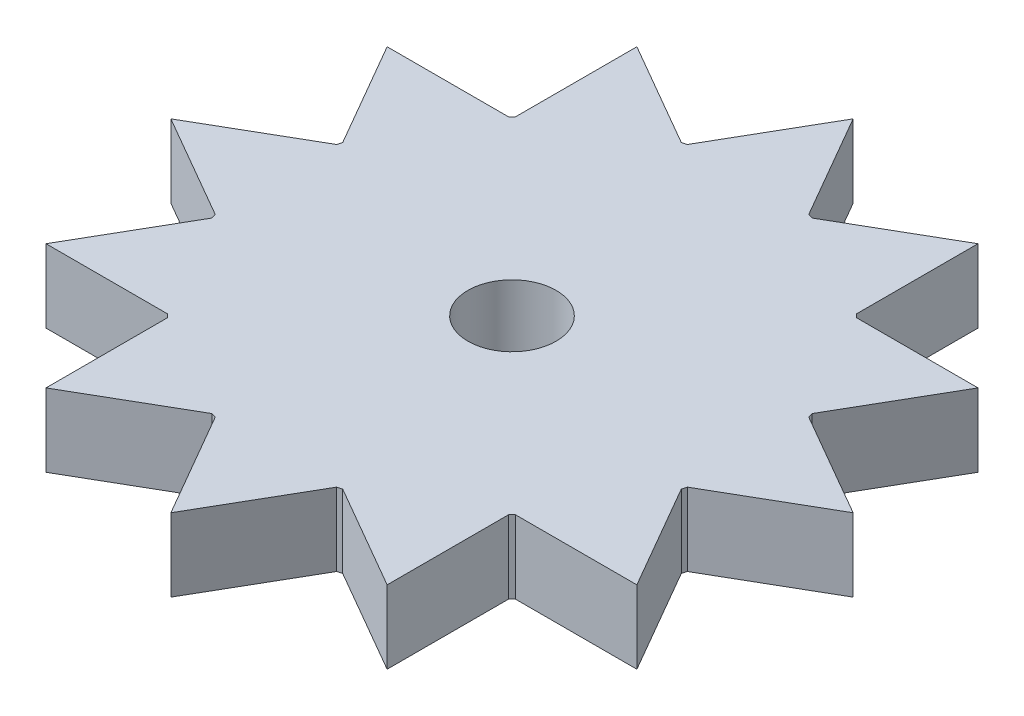
ISO-10303-21;
HEADER;
FILE_DESCRIPTION(('STEP AP214'),'2;1');
FILE_NAME('part.step','',(''),(''),'','','');
FILE_SCHEMA(('AUTOMOTIVE_DESIGN { 1 0 10303 214 1 1 1 1 }'));
ENDSEC;
DATA;
#1=APPLICATION_CONTEXT('core data for automotive mechanical design processes');
#2=APPLICATION_PROTOCOL_DEFINITION('international standard','automotive_design',2000,#1);
#3=PRODUCT_CONTEXT('',#1,'mechanical');
#4=PRODUCT('Part','Part','',(#3));
#5=PRODUCT_RELATED_PRODUCT_CATEGORY('part','',(#4));
#6=PRODUCT_DEFINITION_FORMATION('','',#4);
#7=PRODUCT_DEFINITION_CONTEXT('part definition',#1,'design');
#8=PRODUCT_DEFINITION('design','',#6,#7);
#9=PRODUCT_DEFINITION_SHAPE('','',#8);
#10=(LENGTH_UNIT() NAMED_UNIT(*) SI_UNIT(.MILLI.,.METRE.));
#11=(NAMED_UNIT(*) PLANE_ANGLE_UNIT() SI_UNIT($,.RADIAN.));
#12=(NAMED_UNIT(*) SI_UNIT($,.STERADIAN.) SOLID_ANGLE_UNIT());
#13=UNCERTAINTY_MEASURE_WITH_UNIT(LENGTH_MEASURE(1.E-05),#10,'distance_accuracy_value','');
#14=(GEOMETRIC_REPRESENTATION_CONTEXT(3) GLOBAL_UNCERTAINTY_ASSIGNED_CONTEXT((#13)) GLOBAL_UNIT_ASSIGNED_CONTEXT((#10,
#11,#12)) REPRESENTATION_CONTEXT('',''));
#15=CARTESIAN_POINT('',(0.,0.,0.));
#16=DIRECTION('',(0.,0.,1.));
#17=DIRECTION('',(1.,0.,0.));
#18=AXIS2_PLACEMENT_3D('',#15,#16,#17);
#19=CARTESIAN_POINT('',(0.,3.,0.));
#20=DIRECTION('',(0.,-1.,0.));
#21=DIRECTION('',(0.,0.,-1.));
#22=AXIS2_PLACEMENT_3D('',#19,#20,#21);
#23=CYLINDRICAL_SURFACE('',#22,10.);
#24=CARTESIAN_POINT('',(0.,0.,0.));
#25=DIRECTION('',(0.,1.,0.));
#26=DIRECTION('',(0.,0.,1.));
#27=AXIS2_PLACEMENT_3D('',#24,#25,#26);
#28=CIRCLE('',#27,10.);
#29=CARTESIAN_POINT('',(7.14142842854277,0.,-7.00000000000008));
#30=VERTEX_POINT('',#29);
#31=CARTESIAN_POINT('',(6.99999999999991,0.,-7.14142842854294));
#32=VERTEX_POINT('',#31);
#33=EDGE_CURVE('E516',#30,#32,#28,.T.);
#34=ORIENTED_EDGE('',*,*,#33,.T.);
#35=DIRECTION('',(0.,1.,0.));
#36=VECTOR('',#35,1.);
#37=CARTESIAN_POINT('',(6.99999999999991,0.,-7.14142842854294));
#38=LINE('',#37,#36);
#39=CARTESIAN_POINT('',(6.99999999999991,3.,-7.14142842854294));
#40=VERTEX_POINT('',#39);
#41=EDGE_CURVE('E289',#32,#40,#38,.T.);
#42=ORIENTED_EDGE('',*,*,#41,.T.);
#43=CARTESIAN_POINT('',(0.,3.,0.));
#44=DIRECTION('',(0.,1.,0.));
#45=DIRECTION('',(0.,0.,1.));
#46=AXIS2_PLACEMENT_3D('',#43,#44,#45);
#47=CIRCLE('',#46,10.);
#48=CARTESIAN_POINT('',(7.14142842854277,3.,-7.00000000000008));
#49=VERTEX_POINT('',#48);
#50=EDGE_CURVE('E508',#49,#40,#47,.T.);
#51=ORIENTED_EDGE('',*,*,#50,.F.);
#52=DIRECTION('',(0.,1.,0.));
#53=VECTOR('',#52,1.);
#54=CARTESIAN_POINT('',(7.14142842854277,0.,-7.00000000000008));
#55=LINE('',#54,#53);
#56=EDGE_CURVE('E314',#30,#49,#55,.T.);
#57=ORIENTED_EDGE('',*,*,#56,.F.);
#58=EDGE_LOOP('',(#34,#42,#51,#57));
#59=FACE_BOUND('',#58,.T.);
#60=ADVANCED_FACE('F33',(#59),#23,.T.);
#61=CARTESIAN_POINT('',(9.68465843842647,0.,-2.49146361221975));
#62=VERTEX_POINT('',#61);
#63=CARTESIAN_POINT('',(9.63289204076247,0.,-2.6846584384266));
#64=VERTEX_POINT('',#63);
#65=EDGE_CURVE('E517',#62,#64,#28,.T.);
#66=ORIENTED_EDGE('',*,*,#65,.T.);
#67=DIRECTION('',(0.,1.,0.));
#68=VECTOR('',#67,1.);
#69=CARTESIAN_POINT('',(9.63289204076247,0.,-2.6846584384266));
#70=LINE('',#69,#68);
#71=CARTESIAN_POINT('',(9.63289204076247,3.,-2.6846584384266));
#72=VERTEX_POINT('',#71);
#73=EDGE_CURVE('E310',#64,#72,#70,.T.);
#74=ORIENTED_EDGE('',*,*,#73,.T.);
#75=CARTESIAN_POINT('',(9.68465843842647,3.,-2.49146361221975));
#76=VERTEX_POINT('',#75);
#77=EDGE_CURVE('E509',#76,#72,#47,.T.);
#78=ORIENTED_EDGE('',*,*,#77,.F.);
#79=DIRECTION('',(0.,1.,0.));
#80=VECTOR('',#79,1.);
#81=CARTESIAN_POINT('',(9.68465843842647,0.,-2.49146361221975));
#82=LINE('',#81,#80);
#83=EDGE_CURVE('E331',#62,#76,#82,.T.);
#84=ORIENTED_EDGE('',*,*,#83,.F.);
#85=EDGE_LOOP('',(#66,#74,#78,#84));
#86=FACE_BOUND('',#85,.T.);
#87=ADVANCED_FACE('F592',(#86),#23,.T.);
#88=CARTESIAN_POINT('',(9.63289204076252,0.,2.6846584384264));
#89=VERTEX_POINT('',#88);
#90=CARTESIAN_POINT('',(9.68465843842652,0.,2.49146361221954));
#91=VERTEX_POINT('',#90);
#92=EDGE_CURVE('E521',#89,#91,#28,.T.);
#93=ORIENTED_EDGE('',*,*,#92,.T.);
#94=DIRECTION('',(0.,1.,0.));
#95=VECTOR('',#94,1.);
#96=CARTESIAN_POINT('',(9.68465843842652,0.,2.49146361221954));
#97=LINE('',#96,#95);
#98=CARTESIAN_POINT('',(9.68465843842652,3.,2.49146361221954));
#99=VERTEX_POINT('',#98);
#100=EDGE_CURVE('E327',#91,#99,#97,.T.);
#101=ORIENTED_EDGE('',*,*,#100,.T.);
#102=CARTESIAN_POINT('',(9.63289204076252,3.,2.6846584384264));
#103=VERTEX_POINT('',#102);
#104=EDGE_CURVE('E585',#103,#99,#47,.T.);
#105=ORIENTED_EDGE('',*,*,#104,.F.);
#106=DIRECTION('',(0.,1.,0.));
#107=VECTOR('',#106,1.);
#108=CARTESIAN_POINT('',(9.63289204076252,0.,2.6846584384264));
#109=LINE('',#108,#107);
#110=EDGE_CURVE('E349',#89,#103,#109,.T.);
#111=ORIENTED_EDGE('',*,*,#110,.F.);
#112=EDGE_LOOP('',(#93,#101,#105,#111));
#113=FACE_BOUND('',#112,.T.);
#114=ADVANCED_FACE('F605',(#113),#23,.T.);
#115=CARTESIAN_POINT('',(7.00000000000006,0.,7.1414284285428));
#116=VERTEX_POINT('',#115);
#117=CARTESIAN_POINT('',(7.14142842854292,0.,6.99999999999993));
#118=VERTEX_POINT('',#117);
#119=EDGE_CURVE('E526',#116,#118,#28,.T.);
#120=ORIENTED_EDGE('',*,*,#119,.T.);
#121=DIRECTION('',(0.,1.,0.));
#122=VECTOR('',#121,1.);
#123=CARTESIAN_POINT('',(7.14142842854292,0.,6.99999999999993));
#124=LINE('',#123,#122);
#125=CARTESIAN_POINT('',(7.14142842854292,3.,6.99999999999993));
#126=VERTEX_POINT('',#125);
#127=EDGE_CURVE('E345',#118,#126,#124,.T.);
#128=ORIENTED_EDGE('',*,*,#127,.T.);
#129=CARTESIAN_POINT('',(7.00000000000006,3.,7.14142842854279));
#130=VERTEX_POINT('',#129);
#131=EDGE_CURVE('E582',#130,#126,#47,.T.);
#132=ORIENTED_EDGE('',*,*,#131,.F.);
#133=DIRECTION('',(0.,1.,0.));
#134=VECTOR('',#133,1.);
#135=CARTESIAN_POINT('',(7.00000000000006,0.,7.1414284285428));
#136=LINE('',#135,#134);
#137=EDGE_CURVE('E367',#116,#130,#136,.T.);
#138=ORIENTED_EDGE('',*,*,#137,.F.);
#139=EDGE_LOOP('',(#120,#128,#132,#138));
#140=FACE_BOUND('',#139,.T.);
#141=ADVANCED_FACE('F927',(#140),#23,.T.);
#142=CARTESIAN_POINT('',(2.49146361221964,0.,9.68465843842649));
#143=VERTEX_POINT('',#142);
#144=CARTESIAN_POINT('',(2.68465843842657,0.,9.63289204076248));
#145=VERTEX_POINT('',#144);
#146=EDGE_CURVE('E531',#143,#145,#28,.T.);
#147=ORIENTED_EDGE('',*,*,#146,.T.);
#148=DIRECTION('',(0.,1.,0.));
#149=VECTOR('',#148,1.);
#150=CARTESIAN_POINT('',(2.68465843842657,0.,9.63289204076248));
#151=LINE('',#150,#149);
#152=CARTESIAN_POINT('',(2.68465843842657,3.,9.63289204076248));
#153=VERTEX_POINT('',#152);
#154=EDGE_CURVE('E363',#145,#153,#151,.T.);
#155=ORIENTED_EDGE('',*,*,#154,.T.);
#156=CARTESIAN_POINT('',(2.49146361221965,3.,9.68465843842649));
#157=VERTEX_POINT('',#156);
#158=EDGE_CURVE('E579',#157,#153,#47,.T.);
#159=ORIENTED_EDGE('',*,*,#158,.F.);
#160=DIRECTION('',(0.,1.,0.));
#161=VECTOR('',#160,1.);
#162=CARTESIAN_POINT('',(2.49146361221964,0.,9.68465843842649));
#163=LINE('',#162,#161);
#164=EDGE_CURVE('E385',#143,#157,#163,.T.);
#165=ORIENTED_EDGE('',*,*,#164,.F.);
#166=EDGE_LOOP('',(#147,#155,#159,#165));
#167=FACE_BOUND('',#166,.T.);
#168=ADVANCED_FACE('F919',(#167),#23,.T.);
#169=CARTESIAN_POINT('',(-2.68465843842644,0.,9.63289204076251));
#170=VERTEX_POINT('',#169);
#171=CARTESIAN_POINT('',(-2.49146361221964,0.,9.68465843842649));
#172=VERTEX_POINT('',#171);
#173=EDGE_CURVE('E536',#170,#172,#28,.T.);
#174=ORIENTED_EDGE('',*,*,#173,.T.);
#175=DIRECTION('',(0.,1.,0.));
#176=VECTOR('',#175,1.);
#177=CARTESIAN_POINT('',(-2.49146361221964,0.,9.68465843842649));
#178=LINE('',#177,#176);
#179=CARTESIAN_POINT('',(-2.49146361221964,3.,9.68465843842649));
#180=VERTEX_POINT('',#179);
#181=EDGE_CURVE('E381',#172,#180,#178,.T.);
#182=ORIENTED_EDGE('',*,*,#181,.T.);
#183=CARTESIAN_POINT('',(-2.68465843842644,3.,9.63289204076251));
#184=VERTEX_POINT('',#183);
#185=EDGE_CURVE('E576',#184,#180,#47,.T.);
#186=ORIENTED_EDGE('',*,*,#185,.F.);
#187=DIRECTION('',(0.,1.,0.));
#188=VECTOR('',#187,1.);
#189=CARTESIAN_POINT('',(-2.68465843842644,0.,9.63289204076251));
#190=LINE('',#189,#188);
#191=EDGE_CURVE('E403',#170,#184,#190,.T.);
#192=ORIENTED_EDGE('',*,*,#191,.F.);
#193=EDGE_LOOP('',(#174,#182,#186,#192));
#194=FACE_BOUND('',#193,.T.);
#195=ADVANCED_FACE('F911',(#194),#23,.T.);
#196=CARTESIAN_POINT('',(-7.14142842854282,0.,7.00000000000003));
#197=VERTEX_POINT('',#196);
#198=CARTESIAN_POINT('',(-6.99999999999996,0.,7.14142842854289));
#199=VERTEX_POINT('',#198);
#200=EDGE_CURVE('E541',#197,#199,#28,.T.);
#201=ORIENTED_EDGE('',*,*,#200,.T.);
#202=DIRECTION('',(0.,1.,0.));
#203=VECTOR('',#202,1.);
#204=CARTESIAN_POINT('',(-6.99999999999996,0.,7.14142842854289));
#205=LINE('',#204,#203);
#206=CARTESIAN_POINT('',(-6.99999999999996,3.,7.14142842854289));
#207=VERTEX_POINT('',#206);
#208=EDGE_CURVE('E399',#199,#207,#205,.T.);
#209=ORIENTED_EDGE('',*,*,#208,.T.);
#210=CARTESIAN_POINT('',(-7.14142842854282,3.,7.00000000000003));
#211=VERTEX_POINT('',#210);
#212=EDGE_CURVE('E573',#211,#207,#47,.T.);
#213=ORIENTED_EDGE('',*,*,#212,.F.);
#214=DIRECTION('',(0.,1.,0.));
#215=VECTOR('',#214,1.);
#216=CARTESIAN_POINT('',(-7.14142842854282,0.,7.00000000000003));
#217=LINE('',#216,#215);
#218=EDGE_CURVE('E421',#197,#211,#217,.T.);
#219=ORIENTED_EDGE('',*,*,#218,.F.);
#220=EDGE_LOOP('',(#201,#209,#213,#219));
#221=FACE_BOUND('',#220,.T.);
#222=ADVANCED_FACE('F903',(#221),#23,.T.);
#223=CARTESIAN_POINT('',(-9.68465843842648,0.,2.49146361221968));
#224=VERTEX_POINT('',#223);
#225=CARTESIAN_POINT('',(-9.63289204076249,0.,2.68465843842654));
#226=VERTEX_POINT('',#225);
#227=EDGE_CURVE('E546',#224,#226,#28,.T.);
#228=ORIENTED_EDGE('',*,*,#227,.T.);
#229=DIRECTION('',(0.,1.,0.));
#230=VECTOR('',#229,1.);
#231=CARTESIAN_POINT('',(-9.63289204076249,0.,2.68465843842654));
#232=LINE('',#231,#230);
#233=CARTESIAN_POINT('',(-9.63289204076249,3.,2.68465843842654));
#234=VERTEX_POINT('',#233);
#235=EDGE_CURVE('E417',#226,#234,#232,.T.);
#236=ORIENTED_EDGE('',*,*,#235,.T.);
#237=CARTESIAN_POINT('',(-9.68465843842648,3.,2.49146361221968));
#238=VERTEX_POINT('',#237);
#239=EDGE_CURVE('E571',#238,#234,#47,.T.);
#240=ORIENTED_EDGE('',*,*,#239,.F.);
#241=DIRECTION('',(0.,1.,0.));
#242=VECTOR('',#241,1.);
#243=CARTESIAN_POINT('',(-9.68465843842648,0.,2.49146361221968));
#244=LINE('',#243,#242);
#245=EDGE_CURVE('E439',#224,#238,#244,.T.);
#246=ORIENTED_EDGE('',*,*,#245,.F.);
#247=EDGE_LOOP('',(#228,#236,#240,#246));
#248=FACE_BOUND('',#247,.T.);
#249=ADVANCED_FACE('F622',(#248),#23,.T.);
#250=CARTESIAN_POINT('',(-9.6328920407625,0.,-2.68465843842647));
#251=VERTEX_POINT('',#250);
#252=CARTESIAN_POINT('',(-9.6846584384265,0.,-2.49146361221961));
#253=VERTEX_POINT('',#252);
#254=EDGE_CURVE('E515',#251,#253,#28,.T.);
#255=ORIENTED_EDGE('',*,*,#254,.T.);
#256=DIRECTION('',(0.,1.,0.));
#257=VECTOR('',#256,1.);
#258=CARTESIAN_POINT('',(-9.6846584384265,0.,-2.49146361221961));
#259=LINE('',#258,#257);
#260=CARTESIAN_POINT('',(-9.6846584384265,3.,-2.49146361221961));
#261=VERTEX_POINT('',#260);
#262=EDGE_CURVE('E435',#253,#261,#259,.T.);
#263=ORIENTED_EDGE('',*,*,#262,.T.);
#264=CARTESIAN_POINT('',(-9.6328920407625,3.,-2.68465843842647));
#265=VERTEX_POINT('',#264);
#266=EDGE_CURVE('E569',#265,#261,#47,.T.);
#267=ORIENTED_EDGE('',*,*,#266,.F.);
#268=DIRECTION('',(0.,1.,0.));
#269=VECTOR('',#268,1.);
#270=CARTESIAN_POINT('',(-9.6328920407625,0.,-2.68465843842647));
#271=LINE('',#270,#269);
#272=EDGE_CURVE('E457',#251,#265,#271,.T.);
#273=ORIENTED_EDGE('',*,*,#272,.F.);
#274=EDGE_LOOP('',(#255,#263,#267,#273));
#275=FACE_BOUND('',#274,.T.);
#276=ADVANCED_FACE('F558',(#275),#23,.T.);
#277=CARTESIAN_POINT('',(-7.00000000000001,0.,-7.14142842854284));
#278=VERTEX_POINT('',#277);
#279=CARTESIAN_POINT('',(-7.14142842854287,0.,-6.99999999999998));
#280=VERTEX_POINT('',#279);
#281=EDGE_CURVE('E511',#278,#280,#28,.T.);
#282=ORIENTED_EDGE('',*,*,#281,.T.);
#283=DIRECTION('',(0.,1.,0.));
#284=VECTOR('',#283,1.);
#285=CARTESIAN_POINT('',(-7.14142842854287,0.,-6.99999999999998));
#286=LINE('',#285,#284);
#287=CARTESIAN_POINT('',(-7.14142842854287,3.,-6.99999999999998));
#288=VERTEX_POINT('',#287);
#289=EDGE_CURVE('E453',#280,#288,#286,.T.);
#290=ORIENTED_EDGE('',*,*,#289,.T.);
#291=CARTESIAN_POINT('',(-7.00000000000001,3.,-7.14142842854284));
#292=VERTEX_POINT('',#291);
#293=EDGE_CURVE('E42',#292,#288,#47,.T.);
#294=ORIENTED_EDGE('',*,*,#293,.F.);
#295=DIRECTION('',(0.,1.,0.));
#296=VECTOR('',#295,1.);
#297=CARTESIAN_POINT('',(-7.00000000000001,0.,-7.14142842854284));
#298=LINE('',#297,#296);
#299=EDGE_CURVE('E475',#278,#292,#298,.T.);
#300=ORIENTED_EDGE('',*,*,#299,.F.);
#301=EDGE_LOOP('',(#282,#290,#294,#300));
#302=FACE_BOUND('',#301,.T.);
#303=ADVANCED_FACE('F614',(#302),#23,.T.);
#304=CARTESIAN_POINT('',(-2.49146361221964,0.,-9.68465843842649));
#305=VERTEX_POINT('',#304);
#306=CARTESIAN_POINT('',(-2.6846584384265,0.,-9.63289204076249));
#307=VERTEX_POINT('',#306);
#308=EDGE_CURVE('E37',#305,#307,#28,.T.);
#309=ORIENTED_EDGE('',*,*,#308,.T.);
#310=DIRECTION('',(0.,1.,0.));
#311=VECTOR('',#310,1.);
#312=CARTESIAN_POINT('',(-2.6846584384265,0.,-9.63289204076249));
#313=LINE('',#312,#311);
#314=CARTESIAN_POINT('',(-2.6846584384265,3.,-9.63289204076249));
#315=VERTEX_POINT('',#314);
#316=EDGE_CURVE('E471',#307,#315,#313,.T.);
#317=ORIENTED_EDGE('',*,*,#316,.T.);
#318=CARTESIAN_POINT('',(-2.49146361221965,3.,-9.68465843842649));
#319=VERTEX_POINT('',#318);
#320=EDGE_CURVE('E11',#319,#315,#47,.T.);
#321=ORIENTED_EDGE('',*,*,#320,.F.);
#322=DIRECTION('',(0.,1.,0.));
#323=VECTOR('',#322,1.);
#324=CARTESIAN_POINT('',(-2.49146361221964,0.,-9.68465843842649));
#325=LINE('',#324,#323);
#326=EDGE_CURVE('E492',#305,#319,#325,.T.);
#327=ORIENTED_EDGE('',*,*,#326,.F.);
#328=EDGE_LOOP('',(#309,#317,#321,#327));
#329=FACE_BOUND('',#328,.T.);
#330=ADVANCED_FACE('F607',(#329),#23,.T.);
#331=CARTESIAN_POINT('',(2.68465843842637,3.,-9.63289204076253));
#332=VERTEX_POINT('',#331);
#333=CARTESIAN_POINT('',(2.49146361221964,3.,-9.68465843842649));
#334=VERTEX_POINT('',#333);
#335=EDGE_CURVE('E43',#332,#334,#47,.T.);
#336=ORIENTED_EDGE('',*,*,#335,.F.);
#337=DIRECTION('',(0.,1.,0.));
#338=VECTOR('',#337,1.);
#339=CARTESIAN_POINT('',(2.68465843842637,0.,-9.63289204076253));
#340=LINE('',#339,#338);
#341=CARTESIAN_POINT('',(2.68465843842637,0.,-9.63289204076253));
#342=VERTEX_POINT('',#341);
#343=EDGE_CURVE('E275',#342,#332,#340,.T.);
#344=ORIENTED_EDGE('',*,*,#343,.F.);
#345=CARTESIAN_POINT('',(2.49146361221964,0.,-9.68465843842649));
#346=VERTEX_POINT('',#345);
#347=EDGE_CURVE('E285',#342,#346,#28,.T.);
#348=ORIENTED_EDGE('',*,*,#347,.T.);
#349=DIRECTION('',(0.,1.,0.));
#350=VECTOR('',#349,1.);
#351=CARTESIAN_POINT('',(2.49146361221964,0.,-9.68465843842649));
#352=LINE('',#351,#350);
#353=EDGE_CURVE('E489',#346,#334,#352,.T.);
#354=ORIENTED_EDGE('',*,*,#353,.T.);
#355=EDGE_LOOP('',(#336,#344,#348,#354));
#356=FACE_BOUND('',#355,.T.);
#357=ADVANCED_FACE('F35',(#356),#23,.T.);
#358=CARTESIAN_POINT('',(0.,3.,0.));
#359=DIRECTION('',(0.,1.,0.));
#360=DIRECTION('',(0.,0.,1.));
#361=AXIS2_PLACEMENT_3D('',#358,#359,#360);
#362=PLANE('',#361);
#363=CARTESIAN_POINT('',(0.,3.,0.));
#364=DIRECTION('',(0.,1.,0.));
#365=DIRECTION('',(0.,0.,1.));
#366=AXIS2_PLACEMENT_3D('',#363,#364,#365);
#367=CIRCLE('',#366,1.81);
#368=CARTESIAN_POINT('',(0.,3.,1.81));
#369=VERTEX_POINT('',#368);
#370=EDGE_CURVE('E294',#369,#369,#367,.T.);
#371=ORIENTED_EDGE('',*,*,#370,.F.);
#372=EDGE_LOOP('',(#371));
#373=FACE_BOUND('',#372,.T.);
#374=ORIENTED_EDGE('',*,*,#50,.T.);
#375=DIRECTION('',(0.,0.,-1.));
#376=VECTOR('',#375,1.);
#377=CARTESIAN_POINT('',(6.99999999999991,3.,-7.14142842854294));
#378=LINE('',#377,#376);
#379=CARTESIAN_POINT('',(6.99999999999984,3.,-12.1243556529822));
#380=VERTEX_POINT('',#379);
#381=EDGE_CURVE('E291',#40,#380,#378,.T.);
#382=ORIENTED_EDGE('',*,*,#381,.T.);
#383=DIRECTION('',(-0.866025403784432,0.,0.500000000000011));
#384=VECTOR('',#383,1.);
#385=CARTESIAN_POINT('',(6.99999999999984,3.,-12.1243556529822));
#386=LINE('',#385,#384);
#387=EDGE_CURVE('E50',#380,#332,#386,.T.);
#388=ORIENTED_EDGE('',*,*,#387,.T.);
#389=ORIENTED_EDGE('',*,*,#335,.T.);
#390=DIRECTION('',(-0.5,0.,-0.866025403784439));
#391=VECTOR('',#390,1.);
#392=CARTESIAN_POINT('',(2.49146361221964,3.,-9.68465843842649));
#393=LINE('',#392,#391);
#394=CARTESIAN_POINT('',(0.,3.,-14.));
#395=VERTEX_POINT('',#394);
#396=EDGE_CURVE('E474',#334,#395,#393,.T.);
#397=ORIENTED_EDGE('',*,*,#396,.T.);
#398=DIRECTION('',(-0.5,0.,0.866025403784439));
#399=VECTOR('',#398,1.);
#400=CARTESIAN_POINT('',(0.,3.,-14.));
#401=LINE('',#400,#399);
#402=EDGE_CURVE('E483',#395,#319,#401,.T.);
#403=ORIENTED_EDGE('',*,*,#402,.T.);
#404=ORIENTED_EDGE('',*,*,#320,.T.);
#405=DIRECTION('',(-0.866025403784439,0.,-0.499999999999999));
#406=VECTOR('',#405,1.);
#407=CARTESIAN_POINT('',(-2.6846584384265,3.,-9.63289204076249));
#408=LINE('',#407,#406);
#409=CARTESIAN_POINT('',(-7.00000000000001,3.,-12.1243556529821));
#410=VERTEX_POINT('',#409);
#411=EDGE_CURVE('E456',#315,#410,#408,.T.);
#412=ORIENTED_EDGE('',*,*,#411,.T.);
#413=DIRECTION('',(0.,0.,1.));
#414=VECTOR('',#413,1.);
#415=CARTESIAN_POINT('',(-7.00000000000001,3.,-12.1243556529821));
#416=LINE('',#415,#414);
#417=EDGE_CURVE('E465',#410,#292,#416,.T.);
#418=ORIENTED_EDGE('',*,*,#417,.T.);
#419=ORIENTED_EDGE('',*,*,#293,.T.);
#420=DIRECTION('',(-1.,0.,0.));
#421=VECTOR('',#420,1.);
#422=CARTESIAN_POINT('',(-7.14142842854287,3.,-6.99999999999998));
#423=LINE('',#422,#421);
#424=CARTESIAN_POINT('',(-12.1243556529822,3.,-6.99999999999997));
#425=VERTEX_POINT('',#424);
#426=EDGE_CURVE('E438',#288,#425,#423,.T.);
#427=ORIENTED_EDGE('',*,*,#426,.T.);
#428=DIRECTION('',(0.500000000000002,0.,0.866025403784437));
#429=VECTOR('',#428,1.);
#430=CARTESIAN_POINT('',(-12.1243556529822,3.,-6.99999999999997));
#431=LINE('',#430,#429);
#432=EDGE_CURVE('E447',#425,#265,#431,.T.);
#433=ORIENTED_EDGE('',*,*,#432,.T.);
#434=ORIENTED_EDGE('',*,*,#266,.T.);
#435=DIRECTION('',(-0.866025403784437,0.,0.500000000000003));
#436=VECTOR('',#435,1.);
#437=CARTESIAN_POINT('',(-9.6846584384265,3.,-2.49146361221961));
#438=LINE('',#437,#436);
#439=CARTESIAN_POINT('',(-14.,3.,0.));
#440=VERTEX_POINT('',#439);
#441=EDGE_CURVE('E420',#261,#440,#438,.T.);
#442=ORIENTED_EDGE('',*,*,#441,.T.);
#443=DIRECTION('',(0.86602540378444,0.,0.499999999999997));
#444=VECTOR('',#443,1.);
#445=CARTESIAN_POINT('',(-14.,3.,0.));
#446=LINE('',#445,#444);
#447=EDGE_CURVE('E429',#440,#238,#446,.T.);
#448=ORIENTED_EDGE('',*,*,#447,.T.);
#449=ORIENTED_EDGE('',*,*,#239,.T.);
#450=DIRECTION('',(-0.499999999999996,0.,0.866025403784441));
#451=VECTOR('',#450,1.);
#452=CARTESIAN_POINT('',(-9.63289204076249,3.,2.68465843842654));
#453=LINE('',#452,#451);
#454=CARTESIAN_POINT('',(-12.1243556529821,3.,7.00000000000006));
#455=VERTEX_POINT('',#454);
#456=EDGE_CURVE('E402',#234,#455,#453,.T.);
#457=ORIENTED_EDGE('',*,*,#456,.T.);
#458=DIRECTION('',(1.,0.,0.));
#459=VECTOR('',#458,1.);
#460=CARTESIAN_POINT('',(-12.1243556529821,3.,7.00000000000006));
#461=LINE('',#460,#459);
#462=EDGE_CURVE('E411',#455,#211,#461,.T.);
#463=ORIENTED_EDGE('',*,*,#462,.T.);
#464=ORIENTED_EDGE('',*,*,#212,.T.);
#465=DIRECTION('',(0.,0.,1.));
#466=VECTOR('',#465,1.);
#467=CARTESIAN_POINT('',(-6.99999999999996,3.,7.14142842854289));
#468=LINE('',#467,#466);
#469=CARTESIAN_POINT('',(-6.99999999999993,3.,12.1243556529822));
#470=VERTEX_POINT('',#469);
#471=EDGE_CURVE('E384',#207,#470,#468,.T.);
#472=ORIENTED_EDGE('',*,*,#471,.T.);
#473=DIRECTION('',(0.866025403784436,0.,-0.500000000000005));
#474=VECTOR('',#473,1.);
#475=CARTESIAN_POINT('',(-6.99999999999993,3.,12.1243556529822));
#476=LINE('',#475,#474);
#477=EDGE_CURVE('E393',#470,#184,#476,.T.);
#478=ORIENTED_EDGE('',*,*,#477,.T.);
#479=ORIENTED_EDGE('',*,*,#185,.T.);
#480=DIRECTION('',(0.5,0.,0.866025403784439));
#481=VECTOR('',#480,1.);
#482=CARTESIAN_POINT('',(-2.49146361221964,3.,9.68465843842649));
#483=LINE('',#482,#481);
#484=CARTESIAN_POINT('',(0.,3.,14.));
#485=VERTEX_POINT('',#484);
#486=EDGE_CURVE('E366',#180,#485,#483,.T.);
#487=ORIENTED_EDGE('',*,*,#486,.T.);
#488=DIRECTION('',(0.5,0.,-0.866025403784439));
#489=VECTOR('',#488,1.);
#490=CARTESIAN_POINT('',(0.,3.,14.));
#491=LINE('',#490,#489);
#492=EDGE_CURVE('E375',#485,#157,#491,.T.);
#493=ORIENTED_EDGE('',*,*,#492,.T.);
#494=ORIENTED_EDGE('',*,*,#158,.T.);
#495=DIRECTION('',(0.866025403784443,0.,0.499999999999993));
#496=VECTOR('',#495,1.);
#497=CARTESIAN_POINT('',(2.68465843842657,3.,9.63289204076248));
#498=LINE('',#497,#496);
#499=CARTESIAN_POINT('',(7.0000000000001,3.,12.1243556529821));
#500=VERTEX_POINT('',#499);
#501=EDGE_CURVE('E348',#153,#500,#498,.T.);
#502=ORIENTED_EDGE('',*,*,#501,.T.);
#503=DIRECTION('',(0.,0.,-1.));
#504=VECTOR('',#503,1.);
#505=CARTESIAN_POINT('',(7.0000000000001,3.,12.1243556529821));
#506=LINE('',#505,#504);
#507=EDGE_CURVE('E357',#500,#130,#506,.T.);
#508=ORIENTED_EDGE('',*,*,#507,.T.);
#509=ORIENTED_EDGE('',*,*,#131,.T.);
#510=DIRECTION('',(1.,0.,0.));
#511=VECTOR('',#510,1.);
#512=CARTESIAN_POINT('',(7.14142842854292,3.,6.99999999999993));
#513=LINE('',#512,#511);
#514=CARTESIAN_POINT('',(12.1243556529822,3.,6.99999999999989));
#515=VERTEX_POINT('',#514);
#516=EDGE_CURVE('E330',#126,#515,#513,.T.);
#517=ORIENTED_EDGE('',*,*,#516,.T.);
#518=DIRECTION('',(-0.500000000000008,0.,-0.866025403784434));
#519=VECTOR('',#518,1.);
#520=CARTESIAN_POINT('',(12.1243556529822,3.,6.99999999999989));
#521=LINE('',#520,#519);
#522=EDGE_CURVE('E339',#515,#103,#521,.T.);
#523=ORIENTED_EDGE('',*,*,#522,.T.);
#524=ORIENTED_EDGE('',*,*,#104,.T.);
#525=DIRECTION('',(0.866025403784433,0.,-0.500000000000009));
#526=VECTOR('',#525,1.);
#527=CARTESIAN_POINT('',(9.68465843842652,3.,2.49146361221954));
#528=LINE('',#527,#526);
#529=CARTESIAN_POINT('',(14.,3.,-1.46642216231412E-13));
#530=VERTEX_POINT('',#529);
#531=EDGE_CURVE('E313',#99,#530,#528,.T.);
#532=ORIENTED_EDGE('',*,*,#531,.T.);
#533=DIRECTION('',(-0.866025403784444,0.,-0.499999999999991));
#534=VECTOR('',#533,1.);
#535=CARTESIAN_POINT('',(14.,3.,-1.46642216231412E-13));
#536=LINE('',#535,#534);
#537=EDGE_CURVE('E321',#530,#76,#536,.T.);
#538=ORIENTED_EDGE('',*,*,#537,.T.);
#539=ORIENTED_EDGE('',*,*,#77,.T.);
#540=DIRECTION('',(0.49999999999999,0.,-0.866025403784445));
#541=VECTOR('',#540,1.);
#542=CARTESIAN_POINT('',(9.63289204076247,3.,-2.6846584384266));
#543=LINE('',#542,#541);
#544=CARTESIAN_POINT('',(12.1243556529821,3.,-7.00000000000014));
#545=VERTEX_POINT('',#544);
#546=EDGE_CURVE('E300',#72,#545,#543,.T.);
#547=ORIENTED_EDGE('',*,*,#546,.T.);
#548=DIRECTION('',(-1.,0.,0.));
#549=VECTOR('',#548,1.);
#550=CARTESIAN_POINT('',(12.1243556529821,3.,-7.00000000000014));
#551=LINE('',#550,#549);
#552=EDGE_CURVE('E57',#545,#49,#551,.T.);
#553=ORIENTED_EDGE('',*,*,#552,.T.);
#554=EDGE_LOOP('',(#374,#382,#388,#389,#397,#403,#404,#412,#418,#419,#427,#433,#434,#442,#448,
#449,#457,#463,#464,#472,#478,#479,#487,#493,#494,#502,#508,#509,#517,#523,#524,#532,#538,#539,
#547,#553));
#555=FACE_BOUND('',#554,.T.);
#556=ADVANCED_FACE('F505',(#373,#555),#362,.T.);
#557=CARTESIAN_POINT('',(0.,0.,0.));
#558=DIRECTION('',(0.,1.,0.));
#559=DIRECTION('',(0.,0.,1.));
#560=AXIS2_PLACEMENT_3D('',#557,#558,#559);
#561=PLANE('',#560);
#562=CARTESIAN_POINT('',(0.,0.,0.));
#563=DIRECTION('',(0.,1.,0.));
#564=DIRECTION('',(0.,0.,1.));
#565=AXIS2_PLACEMENT_3D('',#562,#563,#564);
#566=CIRCLE('',#565,1.81);
#567=CARTESIAN_POINT('',(0.,0.,1.81));
#568=VERTEX_POINT('',#567);
#569=EDGE_CURVE('E297',#568,#568,#566,.T.);
#570=ORIENTED_EDGE('',*,*,#569,.T.);
#571=EDGE_LOOP('',(#570));
#572=FACE_BOUND('',#571,.T.);
#573=ORIENTED_EDGE('',*,*,#347,.F.);
#574=DIRECTION('',(-0.866025403784432,0.,0.500000000000011));
#575=VECTOR('',#574,1.);
#576=CARTESIAN_POINT('',(6.99999999999984,0.,-12.1243556529822));
#577=LINE('',#576,#575);
#578=CARTESIAN_POINT('',(6.99999999999984,0.,-12.1243556529822));
#579=VERTEX_POINT('',#578);
#580=EDGE_CURVE('E271',#579,#342,#577,.T.);
#581=ORIENTED_EDGE('',*,*,#580,.F.);
#582=DIRECTION('',(0.,0.,-1.));
#583=VECTOR('',#582,1.);
#584=CARTESIAN_POINT('',(6.99999999999991,0.,-7.14142842854294));
#585=LINE('',#584,#583);
#586=EDGE_CURVE('E282',#32,#579,#585,.T.);
#587=ORIENTED_EDGE('',*,*,#586,.F.);
#588=ORIENTED_EDGE('',*,*,#33,.F.);
#589=DIRECTION('',(-1.,0.,0.));
#590=VECTOR('',#589,1.);
#591=CARTESIAN_POINT('',(12.1243556529821,0.,-7.00000000000014));
#592=LINE('',#591,#590);
#593=CARTESIAN_POINT('',(12.1243556529821,0.,-7.00000000000014));
#594=VERTEX_POINT('',#593);
#595=EDGE_CURVE('E305',#594,#30,#592,.T.);
#596=ORIENTED_EDGE('',*,*,#595,.F.);
#597=DIRECTION('',(0.49999999999999,0.,-0.866025403784445));
#598=VECTOR('',#597,1.);
#599=CARTESIAN_POINT('',(9.63289204076247,0.,-2.6846584384266));
#600=LINE('',#599,#598);
#601=EDGE_CURVE('E302',#64,#594,#600,.T.);
#602=ORIENTED_EDGE('',*,*,#601,.F.);
#603=ORIENTED_EDGE('',*,*,#65,.F.);
#604=DIRECTION('',(-0.866025403784444,0.,-0.499999999999991));
#605=VECTOR('',#604,1.);
#606=CARTESIAN_POINT('',(14.,0.,-1.46642216231412E-13));
#607=LINE('',#606,#605);
#608=CARTESIAN_POINT('',(14.,0.,-1.46642216231412E-13));
#609=VERTEX_POINT('',#608);
#610=EDGE_CURVE('E320',#609,#62,#607,.T.);
#611=ORIENTED_EDGE('',*,*,#610,.F.);
#612=DIRECTION('',(0.866025403784433,0.,-0.500000000000009));
#613=VECTOR('',#612,1.);
#614=CARTESIAN_POINT('',(9.68465843842652,0.,2.49146361221954));
#615=LINE('',#614,#613);
#616=EDGE_CURVE('E317',#91,#609,#615,.T.);
#617=ORIENTED_EDGE('',*,*,#616,.F.);
#618=ORIENTED_EDGE('',*,*,#92,.F.);
#619=DIRECTION('',(-0.500000000000008,0.,-0.866025403784434));
#620=VECTOR('',#619,1.);
#621=CARTESIAN_POINT('',(12.1243556529822,0.,6.99999999999989));
#622=LINE('',#621,#620);
#623=CARTESIAN_POINT('',(12.1243556529822,0.,6.99999999999989));
#624=VERTEX_POINT('',#623);
#625=EDGE_CURVE('E338',#624,#89,#622,.T.);
#626=ORIENTED_EDGE('',*,*,#625,.F.);
#627=DIRECTION('',(1.,0.,0.));
#628=VECTOR('',#627,1.);
#629=CARTESIAN_POINT('',(7.14142842854292,0.,6.99999999999993));
#630=LINE('',#629,#628);
#631=EDGE_CURVE('E335',#118,#624,#630,.T.);
#632=ORIENTED_EDGE('',*,*,#631,.F.);
#633=ORIENTED_EDGE('',*,*,#119,.F.);
#634=DIRECTION('',(0.,0.,-1.));
#635=VECTOR('',#634,1.);
#636=CARTESIAN_POINT('',(7.0000000000001,0.,12.1243556529821));
#637=LINE('',#636,#635);
#638=CARTESIAN_POINT('',(7.0000000000001,0.,12.1243556529821));
#639=VERTEX_POINT('',#638);
#640=EDGE_CURVE('E356',#639,#116,#637,.T.);
#641=ORIENTED_EDGE('',*,*,#640,.F.);
#642=DIRECTION('',(0.866025403784443,0.,0.499999999999993));
#643=VECTOR('',#642,1.);
#644=CARTESIAN_POINT('',(2.68465843842657,0.,9.63289204076248));
#645=LINE('',#644,#643);
#646=EDGE_CURVE('E353',#145,#639,#645,.T.);
#647=ORIENTED_EDGE('',*,*,#646,.F.);
#648=ORIENTED_EDGE('',*,*,#146,.F.);
#649=DIRECTION('',(0.5,0.,-0.866025403784439));
#650=VECTOR('',#649,1.);
#651=CARTESIAN_POINT('',(0.,0.,14.));
#652=LINE('',#651,#650);
#653=CARTESIAN_POINT('',(0.,0.,14.));
#654=VERTEX_POINT('',#653);
#655=EDGE_CURVE('E374',#654,#143,#652,.T.);
#656=ORIENTED_EDGE('',*,*,#655,.F.);
#657=DIRECTION('',(0.5,0.,0.866025403784439));
#658=VECTOR('',#657,1.);
#659=CARTESIAN_POINT('',(-2.49146361221964,0.,9.68465843842649));
#660=LINE('',#659,#658);
#661=EDGE_CURVE('E371',#172,#654,#660,.T.);
#662=ORIENTED_EDGE('',*,*,#661,.F.);
#663=ORIENTED_EDGE('',*,*,#173,.F.);
#664=DIRECTION('',(0.866025403784436,0.,-0.500000000000005));
#665=VECTOR('',#664,1.);
#666=CARTESIAN_POINT('',(-6.99999999999993,0.,12.1243556529822));
#667=LINE('',#666,#665);
#668=CARTESIAN_POINT('',(-6.99999999999993,0.,12.1243556529822));
#669=VERTEX_POINT('',#668);
#670=EDGE_CURVE('E392',#669,#170,#667,.T.);
#671=ORIENTED_EDGE('',*,*,#670,.F.);
#672=DIRECTION('',(0.,0.,1.));
#673=VECTOR('',#672,1.);
#674=CARTESIAN_POINT('',(-6.99999999999996,0.,7.14142842854289));
#675=LINE('',#674,#673);
#676=EDGE_CURVE('E389',#199,#669,#675,.T.);
#677=ORIENTED_EDGE('',*,*,#676,.F.);
#678=ORIENTED_EDGE('',*,*,#200,.F.);
#679=DIRECTION('',(1.,0.,0.));
#680=VECTOR('',#679,1.);
#681=CARTESIAN_POINT('',(-12.1243556529821,0.,7.00000000000006));
#682=LINE('',#681,#680);
#683=CARTESIAN_POINT('',(-12.1243556529821,0.,7.00000000000006));
#684=VERTEX_POINT('',#683);
#685=EDGE_CURVE('E410',#684,#197,#682,.T.);
#686=ORIENTED_EDGE('',*,*,#685,.F.);
#687=DIRECTION('',(-0.499999999999996,0.,0.866025403784441));
#688=VECTOR('',#687,1.);
#689=CARTESIAN_POINT('',(-9.63289204076249,0.,2.68465843842654));
#690=LINE('',#689,#688);
#691=EDGE_CURVE('E407',#226,#684,#690,.T.);
#692=ORIENTED_EDGE('',*,*,#691,.F.);
#693=ORIENTED_EDGE('',*,*,#227,.F.);
#694=DIRECTION('',(0.86602540378444,0.,0.499999999999997));
#695=VECTOR('',#694,1.);
#696=CARTESIAN_POINT('',(-14.,0.,0.));
#697=LINE('',#696,#695);
#698=CARTESIAN_POINT('',(-14.,0.,0.));
#699=VERTEX_POINT('',#698);
#700=EDGE_CURVE('E428',#699,#224,#697,.T.);
#701=ORIENTED_EDGE('',*,*,#700,.F.);
#702=DIRECTION('',(-0.866025403784437,0.,0.500000000000003));
#703=VECTOR('',#702,1.);
#704=CARTESIAN_POINT('',(-9.6846584384265,0.,-2.49146361221961));
#705=LINE('',#704,#703);
#706=EDGE_CURVE('E425',#253,#699,#705,.T.);
#707=ORIENTED_EDGE('',*,*,#706,.F.);
#708=ORIENTED_EDGE('',*,*,#254,.F.);
#709=DIRECTION('',(0.500000000000002,0.,0.866025403784437));
#710=VECTOR('',#709,1.);
#711=CARTESIAN_POINT('',(-12.1243556529822,0.,-6.99999999999997));
#712=LINE('',#711,#710);
#713=CARTESIAN_POINT('',(-12.1243556529822,0.,-6.99999999999997));
#714=VERTEX_POINT('',#713);
#715=EDGE_CURVE('E446',#714,#251,#712,.T.);
#716=ORIENTED_EDGE('',*,*,#715,.F.);
#717=DIRECTION('',(-1.,0.,0.));
#718=VECTOR('',#717,1.);
#719=CARTESIAN_POINT('',(-7.14142842854287,0.,-6.99999999999998));
#720=LINE('',#719,#718);
#721=EDGE_CURVE('E443',#280,#714,#720,.T.);
#722=ORIENTED_EDGE('',*,*,#721,.F.);
#723=ORIENTED_EDGE('',*,*,#281,.F.);
#724=DIRECTION('',(0.,0.,1.));
#725=VECTOR('',#724,1.);
#726=CARTESIAN_POINT('',(-7.00000000000001,0.,-12.1243556529821));
#727=LINE('',#726,#725);
#728=CARTESIAN_POINT('',(-7.00000000000001,0.,-12.1243556529821));
#729=VERTEX_POINT('',#728);
#730=EDGE_CURVE('E464',#729,#278,#727,.T.);
#731=ORIENTED_EDGE('',*,*,#730,.F.);
#732=DIRECTION('',(-0.866025403784439,0.,-0.499999999999999));
#733=VECTOR('',#732,1.);
#734=CARTESIAN_POINT('',(-2.6846584384265,0.,-9.63289204076249));
#735=LINE('',#734,#733);
#736=EDGE_CURVE('E461',#307,#729,#735,.T.);
#737=ORIENTED_EDGE('',*,*,#736,.F.);
#738=ORIENTED_EDGE('',*,*,#308,.F.);
#739=DIRECTION('',(-0.5,0.,0.866025403784439));
#740=VECTOR('',#739,1.);
#741=CARTESIAN_POINT('',(0.,0.,-14.));
#742=LINE('',#741,#740);
#743=CARTESIAN_POINT('',(0.,0.,-14.));
#744=VERTEX_POINT('',#743);
#745=EDGE_CURVE('E482',#744,#305,#742,.T.);
#746=ORIENTED_EDGE('',*,*,#745,.F.);
#747=DIRECTION('',(-0.5,0.,-0.866025403784439));
#748=VECTOR('',#747,1.);
#749=CARTESIAN_POINT('',(2.49146361221964,0.,-9.68465843842649));
#750=LINE('',#749,#748);
#751=EDGE_CURVE('E479',#346,#744,#750,.T.);
#752=ORIENTED_EDGE('',*,*,#751,.F.);
#753=EDGE_LOOP('',(#573,#581,#587,#588,#596,#602,#603,#611,#617,#618,#626,#632,#633,#641,#647,
#648,#656,#662,#663,#671,#677,#678,#686,#692,#693,#701,#707,#708,#716,#722,#723,#731,#737,#738,
#746,#752));
#754=FACE_BOUND('',#753,.T.);
#755=ADVANCED_FACE('F280',(#572,#754),#561,.F.);
#756=CARTESIAN_POINT('',(2.49146361221964,0.,-9.68465843842649));
#757=DIRECTION('',(0.866025403784439,0.,-0.5));
#758=DIRECTION('',(-0.5,0.,-0.866025403784439));
#759=AXIS2_PLACEMENT_3D('',#756,#757,#758);
#760=PLANE('',#759);
#761=ORIENTED_EDGE('',*,*,#396,.F.);
#762=ORIENTED_EDGE('',*,*,#353,.F.);
#763=ORIENTED_EDGE('',*,*,#751,.T.);
#764=DIRECTION('',(0.,1.,0.));
#765=VECTOR('',#764,1.);
#766=CARTESIAN_POINT('',(0.,0.,-14.));
#767=LINE('',#766,#765);
#768=EDGE_CURVE('E485',#744,#395,#767,.T.);
#769=ORIENTED_EDGE('',*,*,#768,.T.);
#770=EDGE_LOOP('',(#761,#762,#763,#769));
#771=FACE_BOUND('',#770,.T.);
#772=ADVANCED_FACE('F498',(#771),#760,.T.);
#773=CARTESIAN_POINT('',(0.,0.,-14.));
#774=DIRECTION('',(-0.866025403784439,0.,-0.5));
#775=DIRECTION('',(-0.5,0.,0.866025403784439));
#776=AXIS2_PLACEMENT_3D('',#773,#774,#775);
#777=PLANE('',#776);
#778=ORIENTED_EDGE('',*,*,#402,.F.);
#779=ORIENTED_EDGE('',*,*,#768,.F.);
#780=ORIENTED_EDGE('',*,*,#745,.T.);
#781=ORIENTED_EDGE('',*,*,#326,.T.);
#782=EDGE_LOOP('',(#778,#779,#780,#781));
#783=FACE_BOUND('',#782,.T.);
#784=ADVANCED_FACE('F502',(#783),#777,.T.);
#785=CARTESIAN_POINT('',(-2.6846584384265,0.,-9.63289204076249));
#786=DIRECTION('',(0.499999999999999,0.,-0.866025403784439));
#787=DIRECTION('',(-0.866025403784439,0.,-0.499999999999999));
#788=AXIS2_PLACEMENT_3D('',#785,#786,#787);
#789=PLANE('',#788);
#790=ORIENTED_EDGE('',*,*,#411,.F.);
#791=ORIENTED_EDGE('',*,*,#316,.F.);
#792=ORIENTED_EDGE('',*,*,#736,.T.);
#793=DIRECTION('',(0.,1.,0.));
#794=VECTOR('',#793,1.);
#795=CARTESIAN_POINT('',(-7.00000000000001,0.,-12.1243556529821));
#796=LINE('',#795,#794);
#797=EDGE_CURVE('E467',#729,#410,#796,.T.);
#798=ORIENTED_EDGE('',*,*,#797,.T.);
#799=EDGE_LOOP('',(#790,#791,#792,#798));
#800=FACE_BOUND('',#799,.T.);
#801=ADVANCED_FACE('F634',(#800),#789,.T.);
#802=CARTESIAN_POINT('',(-7.00000000000001,0.,-12.1243556529821));
#803=DIRECTION('',(-1.,0.,0.));
#804=DIRECTION('',(0.,0.,1.));
#805=AXIS2_PLACEMENT_3D('',#802,#803,#804);
#806=PLANE('',#805);
#807=ORIENTED_EDGE('',*,*,#417,.F.);
#808=ORIENTED_EDGE('',*,*,#797,.F.);
#809=ORIENTED_EDGE('',*,*,#730,.T.);
#810=ORIENTED_EDGE('',*,*,#299,.T.);
#811=EDGE_LOOP('',(#807,#808,#809,#810));
#812=FACE_BOUND('',#811,.T.);
#813=ADVANCED_FACE('F632',(#812),#806,.T.);
#814=CARTESIAN_POINT('',(-7.14142842854287,0.,-6.99999999999998));
#815=DIRECTION('',(0.,0.,-1.));
#816=DIRECTION('',(-1.,0.,0.));
#817=AXIS2_PLACEMENT_3D('',#814,#815,#816);
#818=PLANE('',#817);
#819=ORIENTED_EDGE('',*,*,#426,.F.);
#820=ORIENTED_EDGE('',*,*,#289,.F.);
#821=ORIENTED_EDGE('',*,*,#721,.T.);
#822=DIRECTION('',(0.,1.,0.));
#823=VECTOR('',#822,1.);
#824=CARTESIAN_POINT('',(-12.1243556529822,0.,-6.99999999999997));
#825=LINE('',#824,#823);
#826=EDGE_CURVE('E449',#714,#425,#825,.T.);
#827=ORIENTED_EDGE('',*,*,#826,.T.);
#828=EDGE_LOOP('',(#819,#820,#821,#827));
#829=FACE_BOUND('',#828,.T.);
#830=ADVANCED_FACE('F629',(#829),#818,.T.);
#831=CARTESIAN_POINT('',(-12.1243556529822,0.,-6.99999999999997));
#832=DIRECTION('',(-0.866025403784437,0.,0.500000000000002));
#833=DIRECTION('',(0.500000000000002,0.,0.866025403784437));
#834=AXIS2_PLACEMENT_3D('',#831,#832,#833);
#835=PLANE('',#834);
#836=ORIENTED_EDGE('',*,*,#432,.F.);
#837=ORIENTED_EDGE('',*,*,#826,.F.);
#838=ORIENTED_EDGE('',*,*,#715,.T.);
#839=ORIENTED_EDGE('',*,*,#272,.T.);
#840=EDGE_LOOP('',(#836,#837,#838,#839));
#841=FACE_BOUND('',#840,.T.);
#842=ADVANCED_FACE('F724',(#841),#835,.T.);
#843=CARTESIAN_POINT('',(-9.6846584384265,0.,-2.49146361221961));
#844=DIRECTION('',(-0.500000000000003,0.,-0.866025403784437));
#845=DIRECTION('',(-0.866025403784437,0.,0.500000000000003));
#846=AXIS2_PLACEMENT_3D('',#843,#844,#845);
#847=PLANE('',#846);
#848=ORIENTED_EDGE('',*,*,#441,.F.);
#849=ORIENTED_EDGE('',*,*,#262,.F.);
#850=ORIENTED_EDGE('',*,*,#706,.T.);
#851=DIRECTION('',(0.,1.,0.));
#852=VECTOR('',#851,1.);
#853=CARTESIAN_POINT('',(-14.,0.,0.));
#854=LINE('',#853,#852);
#855=EDGE_CURVE('E431',#699,#440,#854,.T.);
#856=ORIENTED_EDGE('',*,*,#855,.T.);
#857=EDGE_LOOP('',(#848,#849,#850,#856));
#858=FACE_BOUND('',#857,.T.);
#859=ADVANCED_FACE('F566',(#858),#847,.T.);
#860=CARTESIAN_POINT('',(-14.,0.,0.));
#861=DIRECTION('',(-0.499999999999997,0.,0.86602540378444));
#862=DIRECTION('',(0.86602540378444,0.,0.499999999999997));
#863=AXIS2_PLACEMENT_3D('',#860,#861,#862);
#864=PLANE('',#863);
#865=ORIENTED_EDGE('',*,*,#447,.F.);
#866=ORIENTED_EDGE('',*,*,#855,.F.);
#867=ORIENTED_EDGE('',*,*,#700,.T.);
#868=ORIENTED_EDGE('',*,*,#245,.T.);
#869=EDGE_LOOP('',(#865,#866,#867,#868));
#870=FACE_BOUND('',#869,.T.);
#871=ADVANCED_FACE('F717',(#870),#864,.T.);
#872=CARTESIAN_POINT('',(-9.63289204076249,0.,2.68465843842654));
#873=DIRECTION('',(-0.866025403784441,0.,-0.499999999999996));
#874=DIRECTION('',(-0.499999999999996,0.,0.866025403784441));
#875=AXIS2_PLACEMENT_3D('',#872,#873,#874);
#876=PLANE('',#875);
#877=ORIENTED_EDGE('',*,*,#456,.F.);
#878=ORIENTED_EDGE('',*,*,#235,.F.);
#879=ORIENTED_EDGE('',*,*,#691,.T.);
#880=DIRECTION('',(0.,1.,0.));
#881=VECTOR('',#880,1.);
#882=CARTESIAN_POINT('',(-12.1243556529821,0.,7.00000000000006));
#883=LINE('',#882,#881);
#884=EDGE_CURVE('E413',#684,#455,#883,.T.);
#885=ORIENTED_EDGE('',*,*,#884,.T.);
#886=EDGE_LOOP('',(#877,#878,#879,#885));
#887=FACE_BOUND('',#886,.T.);
#888=ADVANCED_FACE('F713',(#887),#876,.T.);
#889=CARTESIAN_POINT('',(-12.1243556529821,0.,7.00000000000006));
#890=DIRECTION('',(0.,0.,1.));
#891=DIRECTION('',(1.,0.,0.));
#892=AXIS2_PLACEMENT_3D('',#889,#890,#891);
#893=PLANE('',#892);
#894=ORIENTED_EDGE('',*,*,#462,.F.);
#895=ORIENTED_EDGE('',*,*,#884,.F.);
#896=ORIENTED_EDGE('',*,*,#685,.T.);
#897=ORIENTED_EDGE('',*,*,#218,.T.);
#898=EDGE_LOOP('',(#894,#895,#896,#897));
#899=FACE_BOUND('',#898,.T.);
#900=ADVANCED_FACE('F709',(#899),#893,.T.);
#901=CARTESIAN_POINT('',(-6.99999999999996,0.,7.14142842854289));
#902=DIRECTION('',(-1.,0.,0.));
#903=DIRECTION('',(0.,0.,1.));
#904=AXIS2_PLACEMENT_3D('',#901,#902,#903);
#905=PLANE('',#904);
#906=ORIENTED_EDGE('',*,*,#471,.F.);
#907=ORIENTED_EDGE('',*,*,#208,.F.);
#908=ORIENTED_EDGE('',*,*,#676,.T.);
#909=DIRECTION('',(0.,1.,0.));
#910=VECTOR('',#909,1.);
#911=CARTESIAN_POINT('',(-6.99999999999993,0.,12.1243556529822));
#912=LINE('',#911,#910);
#913=EDGE_CURVE('E395',#669,#470,#912,.T.);
#914=ORIENTED_EDGE('',*,*,#913,.T.);
#915=EDGE_LOOP('',(#906,#907,#908,#914));
#916=FACE_BOUND('',#915,.T.);
#917=ADVANCED_FACE('F705',(#916),#905,.T.);
#918=CARTESIAN_POINT('',(-6.99999999999993,0.,12.1243556529822));
#919=DIRECTION('',(0.500000000000005,0.,0.866025403784435));
#920=DIRECTION('',(0.866025403784436,0.,-0.500000000000005));
#921=AXIS2_PLACEMENT_3D('',#918,#919,#920);
#922=PLANE('',#921);
#923=ORIENTED_EDGE('',*,*,#477,.F.);
#924=ORIENTED_EDGE('',*,*,#913,.F.);
#925=ORIENTED_EDGE('',*,*,#670,.T.);
#926=ORIENTED_EDGE('',*,*,#191,.T.);
#927=EDGE_LOOP('',(#923,#924,#925,#926));
#928=FACE_BOUND('',#927,.T.);
#929=ADVANCED_FACE('F701',(#928),#922,.T.);
#930=CARTESIAN_POINT('',(-2.49146361221964,0.,9.68465843842649));
#931=DIRECTION('',(-0.866025403784439,0.,0.5));
#932=DIRECTION('',(0.5,0.,0.866025403784439));
#933=AXIS2_PLACEMENT_3D('',#930,#931,#932);
#934=PLANE('',#933);
#935=ORIENTED_EDGE('',*,*,#486,.F.);
#936=ORIENTED_EDGE('',*,*,#181,.F.);
#937=ORIENTED_EDGE('',*,*,#661,.T.);
#938=DIRECTION('',(0.,1.,0.));
#939=VECTOR('',#938,1.);
#940=CARTESIAN_POINT('',(0.,0.,14.));
#941=LINE('',#940,#939);
#942=EDGE_CURVE('E377',#654,#485,#941,.T.);
#943=ORIENTED_EDGE('',*,*,#942,.T.);
#944=EDGE_LOOP('',(#935,#936,#937,#943));
#945=FACE_BOUND('',#944,.T.);
#946=ADVANCED_FACE('F697',(#945),#934,.T.);
#947=CARTESIAN_POINT('',(0.,0.,14.));
#948=DIRECTION('',(0.866025403784439,0.,0.5));
#949=DIRECTION('',(0.5,0.,-0.866025403784439));
#950=AXIS2_PLACEMENT_3D('',#947,#948,#949);
#951=PLANE('',#950);
#952=ORIENTED_EDGE('',*,*,#492,.F.);
#953=ORIENTED_EDGE('',*,*,#942,.F.);
#954=ORIENTED_EDGE('',*,*,#655,.T.);
#955=ORIENTED_EDGE('',*,*,#164,.T.);
#956=EDGE_LOOP('',(#952,#953,#954,#955));
#957=FACE_BOUND('',#956,.T.);
#958=ADVANCED_FACE('F693',(#957),#951,.T.);
#959=CARTESIAN_POINT('',(2.68465843842657,0.,9.63289204076248));
#960=DIRECTION('',(-0.499999999999993,0.,0.866025403784443));
#961=DIRECTION('',(0.866025403784443,0.,0.499999999999993));
#962=AXIS2_PLACEMENT_3D('',#959,#960,#961);
#963=PLANE('',#962);
#964=ORIENTED_EDGE('',*,*,#501,.F.);
#965=ORIENTED_EDGE('',*,*,#154,.F.);
#966=ORIENTED_EDGE('',*,*,#646,.T.);
#967=DIRECTION('',(0.,1.,0.));
#968=VECTOR('',#967,1.);
#969=CARTESIAN_POINT('',(7.0000000000001,0.,12.1243556529821));
#970=LINE('',#969,#968);
#971=EDGE_CURVE('E359',#639,#500,#970,.T.);
#972=ORIENTED_EDGE('',*,*,#971,.T.);
#973=EDGE_LOOP('',(#964,#965,#966,#972));
#974=FACE_BOUND('',#973,.T.);
#975=ADVANCED_FACE('F689',(#974),#963,.T.);
#976=CARTESIAN_POINT('',(7.0000000000001,0.,12.1243556529821));
#977=DIRECTION('',(1.,0.,0.));
#978=DIRECTION('',(0.,0.,-1.));
#979=AXIS2_PLACEMENT_3D('',#976,#977,#978);
#980=PLANE('',#979);
#981=ORIENTED_EDGE('',*,*,#507,.F.);
#982=ORIENTED_EDGE('',*,*,#971,.F.);
#983=ORIENTED_EDGE('',*,*,#640,.T.);
#984=ORIENTED_EDGE('',*,*,#137,.T.);
#985=EDGE_LOOP('',(#981,#982,#983,#984));
#986=FACE_BOUND('',#985,.T.);
#987=ADVANCED_FACE('F685',(#986),#980,.T.);
#988=CARTESIAN_POINT('',(7.14142842854292,0.,6.99999999999993));
#989=DIRECTION('',(0.,0.,1.));
#990=DIRECTION('',(1.,0.,0.));
#991=AXIS2_PLACEMENT_3D('',#988,#989,#990);
#992=PLANE('',#991);
#993=ORIENTED_EDGE('',*,*,#516,.F.);
#994=ORIENTED_EDGE('',*,*,#127,.F.);
#995=ORIENTED_EDGE('',*,*,#631,.T.);
#996=DIRECTION('',(0.,1.,0.));
#997=VECTOR('',#996,1.);
#998=CARTESIAN_POINT('',(12.1243556529822,0.,6.99999999999989));
#999=LINE('',#998,#997);
#1000=EDGE_CURVE('E341',#624,#515,#999,.T.);
#1001=ORIENTED_EDGE('',*,*,#1000,.T.);
#1002=EDGE_LOOP('',(#993,#994,#995,#1001));
#1003=FACE_BOUND('',#1002,.T.);
#1004=ADVANCED_FACE('F681',(#1003),#992,.T.);
#1005=CARTESIAN_POINT('',(12.1243556529822,0.,6.99999999999989));
#1006=DIRECTION('',(0.866025403784434,0.,-0.500000000000008));
#1007=DIRECTION('',(-0.500000000000008,0.,-0.866025403784434));
#1008=AXIS2_PLACEMENT_3D('',#1005,#1006,#1007);
#1009=PLANE('',#1008);
#1010=ORIENTED_EDGE('',*,*,#522,.F.);
#1011=ORIENTED_EDGE('',*,*,#1000,.F.);
#1012=ORIENTED_EDGE('',*,*,#625,.T.);
#1013=ORIENTED_EDGE('',*,*,#110,.T.);
#1014=EDGE_LOOP('',(#1010,#1011,#1012,#1013));
#1015=FACE_BOUND('',#1014,.T.);
#1016=ADVANCED_FACE('F677',(#1015),#1009,.T.);
#1017=CARTESIAN_POINT('',(9.68465843842652,0.,2.49146361221954));
#1018=DIRECTION('',(0.500000000000009,0.,0.866025403784433));
#1019=DIRECTION('',(0.866025403784434,0.,-0.500000000000009));
#1020=AXIS2_PLACEMENT_3D('',#1017,#1018,#1019);
#1021=PLANE('',#1020);
#1022=ORIENTED_EDGE('',*,*,#531,.F.);
#1023=ORIENTED_EDGE('',*,*,#100,.F.);
#1024=ORIENTED_EDGE('',*,*,#616,.T.);
#1025=DIRECTION('',(0.,1.,0.));
#1026=VECTOR('',#1025,1.);
#1027=CARTESIAN_POINT('',(14.,0.,-1.46642216231412E-13));
#1028=LINE('',#1027,#1026);
#1029=EDGE_CURVE('E323',#609,#530,#1028,.T.);
#1030=ORIENTED_EDGE('',*,*,#1029,.T.);
#1031=EDGE_LOOP('',(#1022,#1023,#1024,#1030));
#1032=FACE_BOUND('',#1031,.T.);
#1033=ADVANCED_FACE('F673',(#1032),#1021,.T.);
#1034=CARTESIAN_POINT('',(14.,0.,-1.46642216231412E-13));
#1035=DIRECTION('',(0.499999999999991,0.,-0.866025403784444));
#1036=DIRECTION('',(-0.866025403784444,0.,-0.499999999999991));
#1037=AXIS2_PLACEMENT_3D('',#1034,#1035,#1036);
#1038=PLANE('',#1037);
#1039=ORIENTED_EDGE('',*,*,#537,.F.);
#1040=ORIENTED_EDGE('',*,*,#1029,.F.);
#1041=ORIENTED_EDGE('',*,*,#610,.T.);
#1042=ORIENTED_EDGE('',*,*,#83,.T.);
#1043=EDGE_LOOP('',(#1039,#1040,#1041,#1042));
#1044=FACE_BOUND('',#1043,.T.);
#1045=ADVANCED_FACE('F670',(#1044),#1038,.T.);
#1046=CARTESIAN_POINT('',(9.63289204076247,0.,-2.6846584384266));
#1047=DIRECTION('',(0.866025403784444,0.,0.49999999999999));
#1048=DIRECTION('',(0.49999999999999,0.,-0.866025403784445));
#1049=AXIS2_PLACEMENT_3D('',#1046,#1047,#1048);
#1050=PLANE('',#1049);
#1051=ORIENTED_EDGE('',*,*,#546,.F.);
#1052=ORIENTED_EDGE('',*,*,#73,.F.);
#1053=ORIENTED_EDGE('',*,*,#601,.T.);
#1054=DIRECTION('',(0.,1.,0.));
#1055=VECTOR('',#1054,1.);
#1056=CARTESIAN_POINT('',(12.1243556529821,0.,-7.00000000000014));
#1057=LINE('',#1056,#1055);
#1058=EDGE_CURVE('E307',#594,#545,#1057,.T.);
#1059=ORIENTED_EDGE('',*,*,#1058,.T.);
#1060=EDGE_LOOP('',(#1051,#1052,#1053,#1059));
#1061=FACE_BOUND('',#1060,.T.);
#1062=ADVANCED_FACE('F595',(#1061),#1050,.T.);
#1063=CARTESIAN_POINT('',(12.1243556529821,0.,-7.00000000000014));
#1064=DIRECTION('',(0.,0.,-1.));
#1065=DIRECTION('',(-1.,0.,0.));
#1066=AXIS2_PLACEMENT_3D('',#1063,#1064,#1065);
#1067=PLANE('',#1066);
#1068=ORIENTED_EDGE('',*,*,#552,.F.);
#1069=ORIENTED_EDGE('',*,*,#1058,.F.);
#1070=ORIENTED_EDGE('',*,*,#595,.T.);
#1071=ORIENTED_EDGE('',*,*,#56,.T.);
#1072=EDGE_LOOP('',(#1068,#1069,#1070,#1071));
#1073=FACE_BOUND('',#1072,.T.);
#1074=ADVANCED_FACE('F599',(#1073),#1067,.T.);
#1075=CARTESIAN_POINT('',(6.99999999999991,0.,-7.14142842854294));
#1076=DIRECTION('',(1.,0.,0.));
#1077=DIRECTION('',(0.,0.,-1.));
#1078=AXIS2_PLACEMENT_3D('',#1075,#1076,#1077);
#1079=PLANE('',#1078);
#1080=ORIENTED_EDGE('',*,*,#381,.F.);
#1081=ORIENTED_EDGE('',*,*,#41,.F.);
#1082=ORIENTED_EDGE('',*,*,#586,.T.);
#1083=DIRECTION('',(0.,1.,0.));
#1084=VECTOR('',#1083,1.);
#1085=CARTESIAN_POINT('',(6.99999999999984,0.,-12.1243556529822));
#1086=LINE('',#1085,#1084);
#1087=EDGE_CURVE('E268',#579,#380,#1086,.T.);
#1088=ORIENTED_EDGE('',*,*,#1087,.T.);
#1089=EDGE_LOOP('',(#1080,#1081,#1082,#1088));
#1090=FACE_BOUND('',#1089,.T.);
#1091=ADVANCED_FACE('F287',(#1090),#1079,.T.);
#1092=CARTESIAN_POINT('',(6.99999999999984,0.,-12.1243556529822));
#1093=DIRECTION('',(-0.500000000000011,0.,-0.866025403784432));
#1094=DIRECTION('',(-0.866025403784432,0.,0.500000000000011));
#1095=AXIS2_PLACEMENT_3D('',#1092,#1093,#1094);
#1096=PLANE('',#1095);
#1097=ORIENTED_EDGE('',*,*,#387,.F.);
#1098=ORIENTED_EDGE('',*,*,#1087,.F.);
#1099=ORIENTED_EDGE('',*,*,#580,.T.);
#1100=ORIENTED_EDGE('',*,*,#343,.T.);
#1101=EDGE_LOOP('',(#1097,#1098,#1099,#1100));
#1102=FACE_BOUND('',#1101,.T.);
#1103=ADVANCED_FACE('F270',(#1102),#1096,.T.);
#1104=CARTESIAN_POINT('',(0.,0.,0.));
#1105=DIRECTION('',(0.,1.,0.));
#1106=DIRECTION('',(0.,0.,1.));
#1107=AXIS2_PLACEMENT_3D('',#1104,#1105,#1106);
#1108=CYLINDRICAL_SURFACE('',#1107,1.81);
#1109=ORIENTED_EDGE('',*,*,#569,.F.);
#1110=EDGE_LOOP('',(#1109));
#1111=FACE_BOUND('',#1110,.T.);
#1112=ORIENTED_EDGE('',*,*,#370,.T.);
#1113=EDGE_LOOP('',(#1112));
#1114=FACE_BOUND('',#1113,.T.);
#1115=ADVANCED_FACE('F656',(#1111,#1114),#1108,.F.);
#1116=CLOSED_SHELL('',(#60,#87,#114,#141,#168,#195,#222,#249,#276,#303,#330,#357,#556,#755,#772,
#784,#801,#813,#830,#842,#859,#871,#888,#900,#917,#929,#946,#958,#975,#987,#1004,#1016,#1033,
#1045,#1062,#1074,#1091,#1103,#1115));
#1117=MANIFOLD_SOLID_BREP('B2',#1116);
#1118=ADVANCED_BREP_SHAPE_REPRESENTATION('',(#18,#1117),#14);
#1119=SHAPE_DEFINITION_REPRESENTATION(#9,#1118);
ENDSEC;
END-ISO-10303-21;
